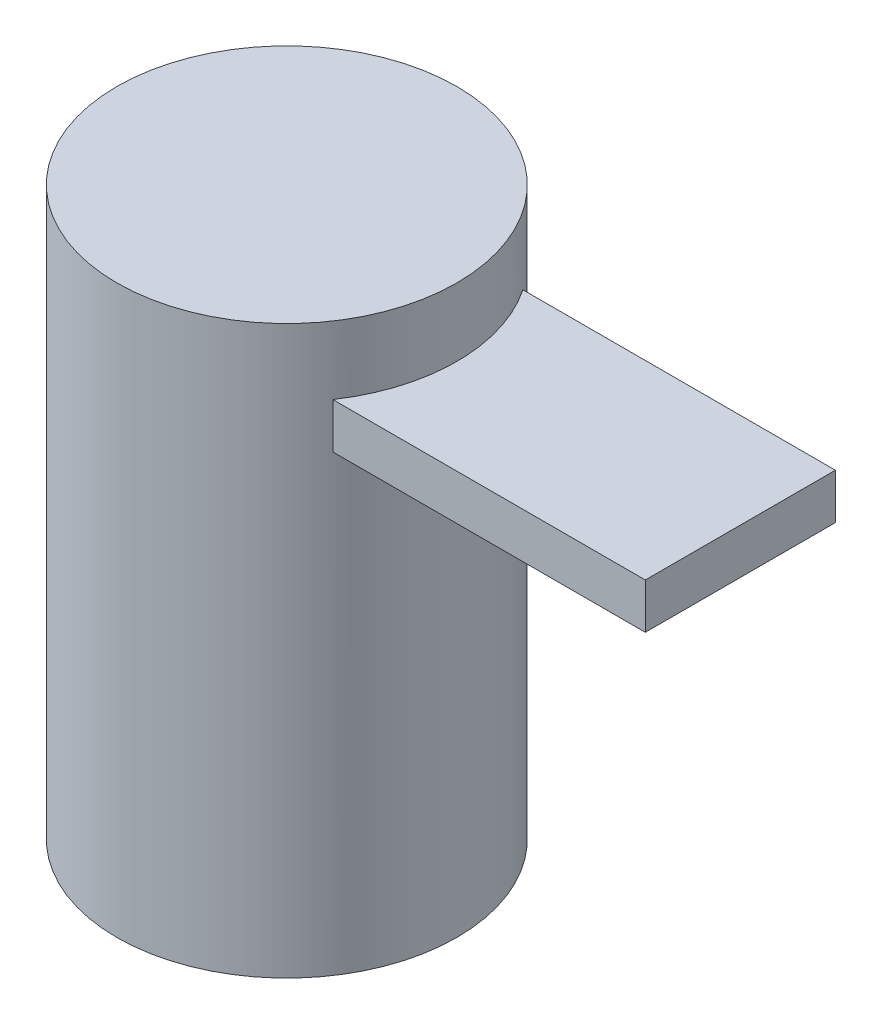
ISO-10303-21;
HEADER;
FILE_DESCRIPTION(('STEP AP214'),'2;1');
FILE_NAME('part.step','',(''),(''),'','','');
FILE_SCHEMA(('AUTOMOTIVE_DESIGN { 1 0 10303 214 1 1 1 1 }'));
ENDSEC;
DATA;
#1=APPLICATION_CONTEXT('core data for automotive mechanical design processes');
#2=APPLICATION_PROTOCOL_DEFINITION('international standard','automotive_design',2000,#1);
#3=PRODUCT_CONTEXT('',#1,'mechanical');
#4=PRODUCT('Part','Part','',(#3));
#5=PRODUCT_RELATED_PRODUCT_CATEGORY('part','',(#4));
#6=PRODUCT_DEFINITION_FORMATION('','',#4);
#7=PRODUCT_DEFINITION_CONTEXT('part definition',#1,'design');
#8=PRODUCT_DEFINITION('design','',#6,#7);
#9=PRODUCT_DEFINITION_SHAPE('','',#8);
#10=(LENGTH_UNIT() NAMED_UNIT(*) SI_UNIT(.MILLI.,.METRE.));
#11=(NAMED_UNIT(*) PLANE_ANGLE_UNIT() SI_UNIT($,.RADIAN.));
#12=(NAMED_UNIT(*) SI_UNIT($,.STERADIAN.) SOLID_ANGLE_UNIT());
#13=UNCERTAINTY_MEASURE_WITH_UNIT(LENGTH_MEASURE(1.E-05),#10,'distance_accuracy_value','');
#14=(GEOMETRIC_REPRESENTATION_CONTEXT(3) GLOBAL_UNCERTAINTY_ASSIGNED_CONTEXT((#13)) GLOBAL_UNIT_ASSIGNED_CONTEXT((#10,
#11,#12)) REPRESENTATION_CONTEXT('',''));
#15=CARTESIAN_POINT('',(0.,0.,0.));
#16=DIRECTION('',(0.,0.,1.));
#17=DIRECTION('',(1.,0.,0.));
#18=AXIS2_PLACEMENT_3D('',#15,#16,#17);
#19=CARTESIAN_POINT('',(-41.25,34.2,-4.66917634450058));
#20=DIRECTION('',(0.,0.,1.));
#21=DIRECTION('',(1.,0.,0.));
#22=AXIS2_PLACEMENT_3D('',#19,#20,#21);
#23=PLANE('',#22);
#24=DIRECTION('',(0.,-1.,0.));
#25=VECTOR('',#24,1.);
#26=CARTESIAN_POINT('',(-40.6280746088065,34.5,-4.66917634450058));
#27=LINE('',#26,#25);
#28=CARTESIAN_POINT('',(-40.6280746088065,34.2,-4.66917634450058));
#29=VERTEX_POINT('',#28);
#30=CARTESIAN_POINT('',(-40.6280746088065,34.,-4.66917634450058));
#31=VERTEX_POINT('',#30);
#32=EDGE_CURVE('E87',#29,#31,#27,.T.);
#33=ORIENTED_EDGE('',*,*,#32,.F.);
#34=DIRECTION('',(-1.,0.,0.));
#35=VECTOR('',#34,1.);
#36=CARTESIAN_POINT('',(-41.25,34.2,-4.66917634450058));
#37=LINE('',#36,#35);
#38=CARTESIAN_POINT('',(-39.25,34.2,-4.66917634450058));
#39=VERTEX_POINT('',#38);
#40=EDGE_CURVE('E76',#39,#29,#37,.T.);
#41=ORIENTED_EDGE('',*,*,#40,.F.);
#42=DIRECTION('',(0.,-1.,0.));
#43=VECTOR('',#42,1.);
#44=CARTESIAN_POINT('',(-39.25,34.2,-4.66917634450058));
#45=LINE('',#44,#43);
#46=CARTESIAN_POINT('',(-39.25,34.,-4.66917634450058));
#47=VERTEX_POINT('',#46);
#48=EDGE_CURVE('E111',#39,#47,#45,.T.);
#49=ORIENTED_EDGE('',*,*,#48,.T.);
#50=DIRECTION('',(-1.,0.,0.));
#51=VECTOR('',#50,1.);
#52=CARTESIAN_POINT('',(-41.25,34.,-4.66917634450058));
#53=LINE('',#52,#51);
#54=EDGE_CURVE('E88',#47,#31,#53,.T.);
#55=ORIENTED_EDGE('',*,*,#54,.T.);
#56=EDGE_LOOP('',(#33,#41,#49,#55));
#57=FACE_BOUND('',#56,.T.);
#58=ADVANCED_FACE('F38',(#57),#23,.F.);
#59=CARTESIAN_POINT('',(-41.25,34.2,-3.83082365549946));
#60=DIRECTION('',(0.,0.,-1.));
#61=DIRECTION('',(-1.,0.,0.));
#62=AXIS2_PLACEMENT_3D('',#59,#60,#61);
#63=PLANE('',#62);
#64=DIRECTION('',(0.,-1.,0.));
#65=VECTOR('',#64,1.);
#66=CARTESIAN_POINT('',(-40.6280746088065,34.5,-3.83082365549946));
#67=LINE('',#66,#65);
#68=CARTESIAN_POINT('',(-40.6280746088065,34.,-3.83082365549946));
#69=VERTEX_POINT('',#68);
#70=CARTESIAN_POINT('',(-40.6280746088065,34.2,-3.83082365549946));
#71=VERTEX_POINT('',#70);
#72=EDGE_CURVE('E91',#69,#71,#67,.F.);
#73=ORIENTED_EDGE('',*,*,#72,.F.);
#74=DIRECTION('',(1.,0.,0.));
#75=VECTOR('',#74,1.);
#76=CARTESIAN_POINT('',(-41.25,34.,-3.83082365549946));
#77=LINE('',#76,#75);
#78=CARTESIAN_POINT('',(-39.25,34.,-3.83082365549946));
#79=VERTEX_POINT('',#78);
#80=EDGE_CURVE('E101',#69,#79,#77,.T.);
#81=ORIENTED_EDGE('',*,*,#80,.T.);
#82=DIRECTION('',(0.,-1.,0.));
#83=VECTOR('',#82,1.);
#84=CARTESIAN_POINT('',(-39.25,34.2,-3.83082365549946));
#85=LINE('',#84,#83);
#86=CARTESIAN_POINT('',(-39.25,34.2,-3.83082365549946));
#87=VERTEX_POINT('',#86);
#88=EDGE_CURVE('E104',#87,#79,#85,.T.);
#89=ORIENTED_EDGE('',*,*,#88,.F.);
#90=DIRECTION('',(1.,0.,0.));
#91=VECTOR('',#90,1.);
#92=CARTESIAN_POINT('',(-41.25,34.2,-3.83082365549946));
#93=LINE('',#92,#91);
#94=EDGE_CURVE('E84',#71,#87,#93,.T.);
#95=ORIENTED_EDGE('',*,*,#94,.F.);
#96=EDGE_LOOP('',(#73,#81,#89,#95));
#97=FACE_BOUND('',#96,.T.);
#98=ADVANCED_FACE('F125',(#97),#63,.F.);
#99=CARTESIAN_POINT('',(-41.25,34.,-4.25000000000002));
#100=DIRECTION('',(0.,-1.,0.));
#101=DIRECTION('',(0.,0.,-1.));
#102=AXIS2_PLACEMENT_3D('',#99,#100,#101);
#103=CYLINDRICAL_SURFACE('',#102,0.749999999999999);
#104=CARTESIAN_POINT('',(-41.25,34.,-4.25000000000002));
#105=DIRECTION('',(0.,1.,0.));
#106=DIRECTION('',(0.,0.,1.));
#107=AXIS2_PLACEMENT_3D('',#104,#105,#106);
#108=CIRCLE('',#107,0.749999999999999);
#109=EDGE_CURVE('E11',#69,#31,#108,.T.);
#110=ORIENTED_EDGE('',*,*,#109,.F.);
#111=ORIENTED_EDGE('',*,*,#72,.T.);
#112=CARTESIAN_POINT('',(-41.25,34.2,-4.25000000000002));
#113=DIRECTION('',(0.,-1.,0.));
#114=DIRECTION('',(0.,0.,-1.));
#115=AXIS2_PLACEMENT_3D('',#112,#113,#114);
#116=CIRCLE('',#115,0.749999999999998);
#117=EDGE_CURVE('E53',#71,#29,#116,.F.);
#118=ORIENTED_EDGE('',*,*,#117,.T.);
#119=ORIENTED_EDGE('',*,*,#32,.T.);
#120=EDGE_LOOP('',(#110,#111,#118,#119));
#121=FACE_BOUND('',#120,.T.);
#122=CARTESIAN_POINT('',(-41.25,32.,-4.25000000000002));
#123=DIRECTION('',(0.,1.,0.));
#124=DIRECTION('',(0.,0.,1.));
#125=AXIS2_PLACEMENT_3D('',#122,#123,#124);
#126=CIRCLE('',#125,0.749999999999999);
#127=CARTESIAN_POINT('',(-41.25,32.,-3.50000000000002));
#128=VERTEX_POINT('',#127);
#129=EDGE_CURVE('E42',#128,#128,#126,.T.);
#130=ORIENTED_EDGE('',*,*,#129,.T.);
#131=EDGE_LOOP('',(#130));
#132=FACE_BOUND('',#131,.T.);
#133=CARTESIAN_POINT('',(-41.25,34.5,-4.25000000000002));
#134=DIRECTION('',(0.,1.,0.));
#135=DIRECTION('',(0.,0.,1.));
#136=AXIS2_PLACEMENT_3D('',#133,#134,#135);
#137=CIRCLE('',#136,0.749999999999998);
#138=CARTESIAN_POINT('',(-41.25,34.5,-3.50000000000002));
#139=VERTEX_POINT('',#138);
#140=EDGE_CURVE('E95',#139,#139,#137,.T.);
#141=ORIENTED_EDGE('',*,*,#140,.F.);
#142=EDGE_LOOP('',(#141));
#143=FACE_BOUND('',#142,.T.);
#144=ADVANCED_FACE('F40',(#121,#132,#143),#103,.T.);
#145=CARTESIAN_POINT('',(-41.25,32.,-4.25000000000002));
#146=DIRECTION('',(0.,1.,0.));
#147=DIRECTION('',(0.,0.,1.));
#148=AXIS2_PLACEMENT_3D('',#145,#146,#147);
#149=PLANE('',#148);
#150=ORIENTED_EDGE('',*,*,#129,.F.);
#151=EDGE_LOOP('',(#150));
#152=FACE_BOUND('',#151,.T.);
#153=ADVANCED_FACE('F116',(#152),#149,.F.);
#154=CARTESIAN_POINT('',(-39.25,34.2,-3.83082365549946));
#155=DIRECTION('',(-1.,0.,0.));
#156=DIRECTION('',(0.,0.,1.));
#157=AXIS2_PLACEMENT_3D('',#154,#155,#156);
#158=PLANE('',#157);
#159=DIRECTION('',(0.,0.,-1.));
#160=VECTOR('',#159,1.);
#161=CARTESIAN_POINT('',(-39.25,34.,-3.83082365549946));
#162=LINE('',#161,#160);
#163=EDGE_CURVE('E90',#79,#47,#162,.T.);
#164=ORIENTED_EDGE('',*,*,#163,.T.);
#165=ORIENTED_EDGE('',*,*,#48,.F.);
#166=DIRECTION('',(0.,0.,-1.));
#167=VECTOR('',#166,1.);
#168=CARTESIAN_POINT('',(-39.25,34.2,-3.83082365549946));
#169=LINE('',#168,#167);
#170=EDGE_CURVE('E80',#87,#39,#169,.T.);
#171=ORIENTED_EDGE('',*,*,#170,.F.);
#172=ORIENTED_EDGE('',*,*,#88,.T.);
#173=EDGE_LOOP('',(#164,#165,#171,#172));
#174=FACE_BOUND('',#173,.T.);
#175=ADVANCED_FACE('F118',(#174),#158,.F.);
#176=CARTESIAN_POINT('',(0.,34.2,0.));
#177=DIRECTION('',(0.,-1.,0.));
#178=DIRECTION('',(0.,0.,-1.));
#179=AXIS2_PLACEMENT_3D('',#176,#177,#178);
#180=PLANE('',#179);
#181=ORIENTED_EDGE('',*,*,#117,.F.);
#182=ORIENTED_EDGE('',*,*,#94,.T.);
#183=ORIENTED_EDGE('',*,*,#170,.T.);
#184=ORIENTED_EDGE('',*,*,#40,.T.);
#185=EDGE_LOOP('',(#181,#182,#183,#184));
#186=FACE_BOUND('',#185,.T.);
#187=ADVANCED_FACE('F78',(#186),#180,.F.);
#188=CARTESIAN_POINT('',(0.,34.,0.));
#189=DIRECTION('',(0.,-1.,0.));
#190=DIRECTION('',(0.,0.,-1.));
#191=AXIS2_PLACEMENT_3D('',#188,#189,#190);
#192=PLANE('',#191);
#193=ORIENTED_EDGE('',*,*,#80,.F.);
#194=ORIENTED_EDGE('',*,*,#109,.T.);
#195=ORIENTED_EDGE('',*,*,#54,.F.);
#196=ORIENTED_EDGE('',*,*,#163,.F.);
#197=EDGE_LOOP('',(#193,#194,#195,#196));
#198=FACE_BOUND('',#197,.T.);
#199=ADVANCED_FACE('F134',(#198),#192,.T.);
#200=CARTESIAN_POINT('',(-41.25,34.5,-4.25000000000002));
#201=DIRECTION('',(0.,1.,0.));
#202=DIRECTION('',(0.,0.,1.));
#203=AXIS2_PLACEMENT_3D('',#200,#201,#202);
#204=PLANE('',#203);
#205=ORIENTED_EDGE('',*,*,#140,.T.);
#206=EDGE_LOOP('',(#205));
#207=FACE_BOUND('',#206,.T.);
#208=ADVANCED_FACE('F137',(#207),#204,.T.);
#209=CLOSED_SHELL('',(#58,#98,#144,#153,#175,#187,#199,#208));
#210=MANIFOLD_SOLID_BREP('B2',#209);
#211=ADVANCED_BREP_SHAPE_REPRESENTATION('',(#18,#210),#14);
#212=SHAPE_DEFINITION_REPRESENTATION(#9,#211);
ENDSEC;
END-ISO-10303-21;
